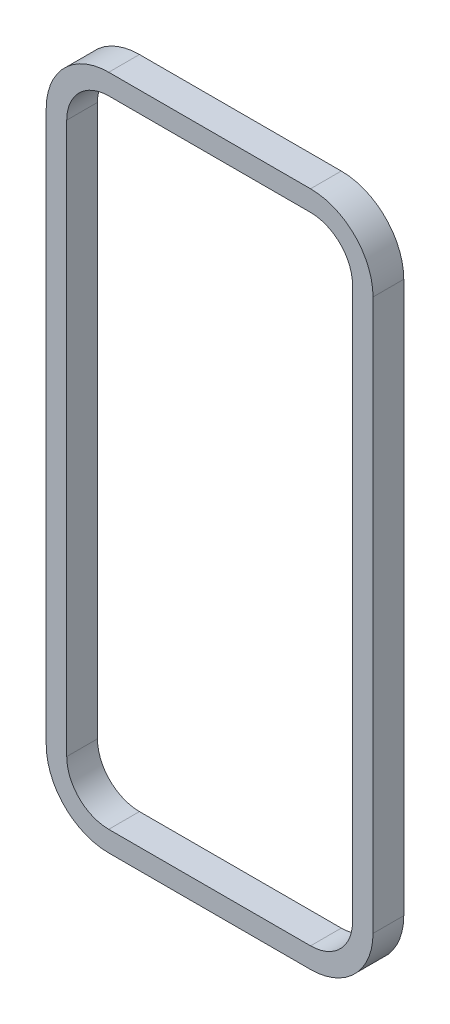
ISO-10303-21;
HEADER;
FILE_DESCRIPTION(('STEP AP214'),'2;1');
FILE_NAME('part.step','',(''),(''),'','','');
FILE_SCHEMA(('AUTOMOTIVE_DESIGN { 1 0 10303 214 1 1 1 1 }'));
ENDSEC;
DATA;
#1=APPLICATION_CONTEXT('core data for automotive mechanical design processes');
#2=APPLICATION_PROTOCOL_DEFINITION('international standard','automotive_design',2000,#1);
#3=PRODUCT_CONTEXT('',#1,'mechanical');
#4=PRODUCT('Part','Part','',(#3));
#5=PRODUCT_RELATED_PRODUCT_CATEGORY('part','',(#4));
#6=PRODUCT_DEFINITION_FORMATION('','',#4);
#7=PRODUCT_DEFINITION_CONTEXT('part definition',#1,'design');
#8=PRODUCT_DEFINITION('design','',#6,#7);
#9=PRODUCT_DEFINITION_SHAPE('','',#8);
#10=(LENGTH_UNIT() NAMED_UNIT(*) SI_UNIT(.MILLI.,.METRE.));
#11=(NAMED_UNIT(*) PLANE_ANGLE_UNIT() SI_UNIT($,.RADIAN.));
#12=(NAMED_UNIT(*) SI_UNIT($,.STERADIAN.) SOLID_ANGLE_UNIT());
#13=UNCERTAINTY_MEASURE_WITH_UNIT(LENGTH_MEASURE(1.E-05),#10,'distance_accuracy_value','');
#14=(GEOMETRIC_REPRESENTATION_CONTEXT(3) GLOBAL_UNCERTAINTY_ASSIGNED_CONTEXT((#13)) GLOBAL_UNIT_ASSIGNED_CONTEXT((#10,
#11,#12)) REPRESENTATION_CONTEXT('',''));
#15=CARTESIAN_POINT('',(0.,0.,0.));
#16=DIRECTION('',(0.,0.,1.));
#17=DIRECTION('',(1.,0.,0.));
#18=AXIS2_PLACEMENT_3D('',#15,#16,#17);
#19=CARTESIAN_POINT('',(-9.85,-26.9,3.));
#20=DIRECTION('',(0.,0.,-1.));
#21=DIRECTION('',(-1.,0.,0.));
#22=AXIS2_PLACEMENT_3D('',#19,#20,#21);
#23=PLANE('',#22);
#24=CARTESIAN_POINT('',(-9.85,-26.9,3.));
#25=DIRECTION('',(0.,0.,1.));
#26=DIRECTION('',(-1.,0.,0.));
#27=AXIS2_PLACEMENT_3D('',#24,#25,#26);
#28=CIRCLE('',#27,6.1);
#29=CARTESIAN_POINT('',(-15.95,-26.9,3.));
#30=VERTEX_POINT('',#29);
#31=CARTESIAN_POINT('',(-9.84999999999997,-33.,3.));
#32=VERTEX_POINT('',#31);
#33=EDGE_CURVE('E247',#30,#32,#28,.T.);
#34=ORIENTED_EDGE('',*,*,#33,.T.);
#35=DIRECTION('',(1.,0.,0.));
#36=VECTOR('',#35,1.);
#37=CARTESIAN_POINT('',(9.84999999999996,-33.,3.));
#38=LINE('',#37,#36);
#39=CARTESIAN_POINT('',(9.84999999999996,-33.,3.));
#40=VERTEX_POINT('',#39);
#41=EDGE_CURVE('E251',#32,#40,#38,.T.);
#42=ORIENTED_EDGE('',*,*,#41,.T.);
#43=CARTESIAN_POINT('',(9.85,-26.9,3.));
#44=DIRECTION('',(0.,0.,1.));
#45=DIRECTION('',(-1.,0.,0.));
#46=AXIS2_PLACEMENT_3D('',#43,#44,#45);
#47=CIRCLE('',#46,6.1);
#48=CARTESIAN_POINT('',(15.95,-26.9,3.));
#49=VERTEX_POINT('',#48);
#50=EDGE_CURVE('E255',#40,#49,#47,.T.);
#51=ORIENTED_EDGE('',*,*,#50,.T.);
#52=DIRECTION('',(0.,1.,0.));
#53=VECTOR('',#52,1.);
#54=CARTESIAN_POINT('',(15.95,-26.9,3.));
#55=LINE('',#54,#53);
#56=CARTESIAN_POINT('',(15.95,26.8999999999999,3.));
#57=VERTEX_POINT('',#56);
#58=EDGE_CURVE('E258',#49,#57,#55,.T.);
#59=ORIENTED_EDGE('',*,*,#58,.T.);
#60=CARTESIAN_POINT('',(9.85,26.9,3.));
#61=DIRECTION('',(0.,0.,1.));
#62=DIRECTION('',(1.,0.,0.));
#63=AXIS2_PLACEMENT_3D('',#60,#61,#62);
#64=CIRCLE('',#63,6.1);
#65=CARTESIAN_POINT('',(9.84999999999997,33.,3.));
#66=VERTEX_POINT('',#65);
#67=EDGE_CURVE('E261',#57,#66,#64,.T.);
#68=ORIENTED_EDGE('',*,*,#67,.T.);
#69=DIRECTION('',(-1.,0.,0.));
#70=VECTOR('',#69,1.);
#71=CARTESIAN_POINT('',(9.84999999999997,33.,3.));
#72=LINE('',#71,#70);
#73=CARTESIAN_POINT('',(-9.84999999999995,33.,3.));
#74=VERTEX_POINT('',#73);
#75=EDGE_CURVE('E264',#66,#74,#72,.T.);
#76=ORIENTED_EDGE('',*,*,#75,.T.);
#77=CARTESIAN_POINT('',(-9.85,26.9,3.));
#78=DIRECTION('',(0.,0.,1.));
#79=DIRECTION('',(-1.,0.,0.));
#80=AXIS2_PLACEMENT_3D('',#77,#78,#79);
#81=CIRCLE('',#80,6.1);
#82=CARTESIAN_POINT('',(-15.95,26.9,3.));
#83=VERTEX_POINT('',#82);
#84=EDGE_CURVE('E267',#74,#83,#81,.T.);
#85=ORIENTED_EDGE('',*,*,#84,.T.);
#86=DIRECTION('',(0.,-1.,0.));
#87=VECTOR('',#86,1.);
#88=CARTESIAN_POINT('',(-15.95,-26.9,3.));
#89=LINE('',#88,#87);
#90=EDGE_CURVE('E270',#83,#30,#89,.T.);
#91=ORIENTED_EDGE('',*,*,#90,.T.);
#92=EDGE_LOOP('',(#34,#42,#51,#59,#68,#76,#85,#91));
#93=FACE_BOUND('',#92,.T.);
#94=CARTESIAN_POINT('',(-9.85,-26.9,3.));
#95=DIRECTION('',(0.,0.,1.));
#96=DIRECTION('',(-1.,0.,0.));
#97=AXIS2_PLACEMENT_3D('',#94,#95,#96);
#98=CIRCLE('',#97,4.1);
#99=CARTESIAN_POINT('',(-13.95,-26.9,3.));
#100=VERTEX_POINT('',#99);
#101=CARTESIAN_POINT('',(-9.84999999999997,-31.,3.));
#102=VERTEX_POINT('',#101);
#103=EDGE_CURVE('E157',#100,#102,#98,.T.);
#104=ORIENTED_EDGE('',*,*,#103,.F.);
#105=DIRECTION('',(0.,-1.,0.));
#106=VECTOR('',#105,1.);
#107=CARTESIAN_POINT('',(-13.95,-26.9,3.));
#108=LINE('',#107,#106);
#109=CARTESIAN_POINT('',(-13.95,26.9,3.));
#110=VERTEX_POINT('',#109);
#111=EDGE_CURVE('E200',#110,#100,#108,.T.);
#112=ORIENTED_EDGE('',*,*,#111,.F.);
#113=CARTESIAN_POINT('',(-9.85,26.9,3.));
#114=DIRECTION('',(0.,0.,1.));
#115=DIRECTION('',(-1.,0.,0.));
#116=AXIS2_PLACEMENT_3D('',#113,#114,#115);
#117=CIRCLE('',#116,4.09999999999999);
#118=CARTESIAN_POINT('',(-9.84999999999997,31.,3.));
#119=VERTEX_POINT('',#118);
#120=EDGE_CURVE('E197',#119,#110,#117,.T.);
#121=ORIENTED_EDGE('',*,*,#120,.F.);
#122=DIRECTION('',(-1.,0.,0.));
#123=VECTOR('',#122,1.);
#124=CARTESIAN_POINT('',(9.84999999999997,31.,3.));
#125=LINE('',#124,#123);
#126=CARTESIAN_POINT('',(9.84999999999997,31.,3.));
#127=VERTEX_POINT('',#126);
#128=EDGE_CURVE('E194',#127,#119,#125,.T.);
#129=ORIENTED_EDGE('',*,*,#128,.F.);
#130=CARTESIAN_POINT('',(9.85,26.9,3.));
#131=DIRECTION('',(0.,0.,1.));
#132=DIRECTION('',(1.,0.,0.));
#133=AXIS2_PLACEMENT_3D('',#130,#131,#132);
#134=CIRCLE('',#133,4.1);
#135=CARTESIAN_POINT('',(13.95,26.9,3.));
#136=VERTEX_POINT('',#135);
#137=EDGE_CURVE('E191',#136,#127,#134,.T.);
#138=ORIENTED_EDGE('',*,*,#137,.F.);
#139=DIRECTION('',(0.,1.,0.));
#140=VECTOR('',#139,1.);
#141=CARTESIAN_POINT('',(13.95,-26.9,3.));
#142=LINE('',#141,#140);
#143=CARTESIAN_POINT('',(13.95,-26.9,3.));
#144=VERTEX_POINT('',#143);
#145=EDGE_CURVE('E186',#144,#136,#142,.T.);
#146=ORIENTED_EDGE('',*,*,#145,.F.);
#147=CARTESIAN_POINT('',(9.85,-26.9,3.));
#148=DIRECTION('',(0.,0.,1.));
#149=DIRECTION('',(-1.,0.,0.));
#150=AXIS2_PLACEMENT_3D('',#147,#148,#149);
#151=CIRCLE('',#150,4.1);
#152=CARTESIAN_POINT('',(9.84999999999998,-31.,3.));
#153=VERTEX_POINT('',#152);
#154=EDGE_CURVE('E180',#153,#144,#151,.T.);
#155=ORIENTED_EDGE('',*,*,#154,.F.);
#156=DIRECTION('',(1.,0.,0.));
#157=VECTOR('',#156,1.);
#158=CARTESIAN_POINT('',(9.84999999999997,-31.,3.));
#159=LINE('',#158,#157);
#160=EDGE_CURVE('E166',#102,#153,#159,.T.);
#161=ORIENTED_EDGE('',*,*,#160,.F.);
#162=EDGE_LOOP('',(#104,#112,#121,#129,#138,#146,#155,#161));
#163=FACE_BOUND('',#162,.T.);
#164=ADVANCED_FACE('F43',(#93,#163),#23,.F.);
#165=CARTESIAN_POINT('',(-9.85,-26.9,0.));
#166=DIRECTION('',(0.,0.,-1.));
#167=DIRECTION('',(-1.,0.,0.));
#168=AXIS2_PLACEMENT_3D('',#165,#166,#167);
#169=PLANE('',#168);
#170=CARTESIAN_POINT('',(-9.85,-26.9,0.));
#171=DIRECTION('',(0.,0.,1.));
#172=DIRECTION('',(-1.,0.,0.));
#173=AXIS2_PLACEMENT_3D('',#170,#171,#172);
#174=CIRCLE('',#173,6.1);
#175=CARTESIAN_POINT('',(-15.95,-26.9,0.));
#176=VERTEX_POINT('',#175);
#177=CARTESIAN_POINT('',(-9.84999999999997,-33.,0.));
#178=VERTEX_POINT('',#177);
#179=EDGE_CURVE('E175',#176,#178,#174,.T.);
#180=ORIENTED_EDGE('',*,*,#179,.F.);
#181=DIRECTION('',(0.,-1.,0.));
#182=VECTOR('',#181,1.);
#183=CARTESIAN_POINT('',(-15.95,-26.9,0.));
#184=LINE('',#183,#182);
#185=CARTESIAN_POINT('',(-15.95,26.9,0.));
#186=VERTEX_POINT('',#185);
#187=EDGE_CURVE('E252',#186,#176,#184,.T.);
#188=ORIENTED_EDGE('',*,*,#187,.F.);
#189=CARTESIAN_POINT('',(-9.85,26.9,0.));
#190=DIRECTION('',(0.,0.,1.));
#191=DIRECTION('',(-1.,0.,0.));
#192=AXIS2_PLACEMENT_3D('',#189,#190,#191);
#193=CIRCLE('',#192,6.1);
#194=CARTESIAN_POINT('',(-9.84999999999995,33.,0.));
#195=VERTEX_POINT('',#194);
#196=EDGE_CURVE('E292',#195,#186,#193,.T.);
#197=ORIENTED_EDGE('',*,*,#196,.F.);
#198=DIRECTION('',(-1.,0.,0.));
#199=VECTOR('',#198,1.);
#200=CARTESIAN_POINT('',(9.84999999999997,33.,0.));
#201=LINE('',#200,#199);
#202=CARTESIAN_POINT('',(9.84999999999997,33.,0.));
#203=VERTEX_POINT('',#202);
#204=EDGE_CURVE('E289',#203,#195,#201,.T.);
#205=ORIENTED_EDGE('',*,*,#204,.F.);
#206=CARTESIAN_POINT('',(9.85,26.9,0.));
#207=DIRECTION('',(0.,0.,1.));
#208=DIRECTION('',(1.,0.,0.));
#209=AXIS2_PLACEMENT_3D('',#206,#207,#208);
#210=CIRCLE('',#209,6.1);
#211=CARTESIAN_POINT('',(15.95,26.8999999999999,0.));
#212=VERTEX_POINT('',#211);
#213=EDGE_CURVE('E286',#212,#203,#210,.T.);
#214=ORIENTED_EDGE('',*,*,#213,.F.);
#215=DIRECTION('',(0.,1.,0.));
#216=VECTOR('',#215,1.);
#217=CARTESIAN_POINT('',(15.95,-26.9,0.));
#218=LINE('',#217,#216);
#219=CARTESIAN_POINT('',(15.95,-26.9,0.));
#220=VERTEX_POINT('',#219);
#221=EDGE_CURVE('E283',#220,#212,#218,.T.);
#222=ORIENTED_EDGE('',*,*,#221,.F.);
#223=CARTESIAN_POINT('',(9.85,-26.9,0.));
#224=DIRECTION('',(0.,0.,1.));
#225=DIRECTION('',(-1.,0.,0.));
#226=AXIS2_PLACEMENT_3D('',#223,#224,#225);
#227=CIRCLE('',#226,6.1);
#228=CARTESIAN_POINT('',(9.84999999999996,-33.,0.));
#229=VERTEX_POINT('',#228);
#230=EDGE_CURVE('E280',#229,#220,#227,.T.);
#231=ORIENTED_EDGE('',*,*,#230,.F.);
#232=DIRECTION('',(1.,0.,0.));
#233=VECTOR('',#232,1.);
#234=CARTESIAN_POINT('',(9.84999999999996,-33.,0.));
#235=LINE('',#234,#233);
#236=EDGE_CURVE('E277',#178,#229,#235,.T.);
#237=ORIENTED_EDGE('',*,*,#236,.F.);
#238=EDGE_LOOP('',(#180,#188,#197,#205,#214,#222,#231,#237));
#239=FACE_BOUND('',#238,.T.);
#240=DIRECTION('',(0.,-1.,0.));
#241=VECTOR('',#240,1.);
#242=CARTESIAN_POINT('',(-13.95,-26.9,0.));
#243=LINE('',#242,#241);
#244=CARTESIAN_POINT('',(-13.95,26.9,0.));
#245=VERTEX_POINT('',#244);
#246=CARTESIAN_POINT('',(-13.95,-26.9,0.));
#247=VERTEX_POINT('',#246);
#248=EDGE_CURVE('E167',#245,#247,#243,.T.);
#249=ORIENTED_EDGE('',*,*,#248,.T.);
#250=CARTESIAN_POINT('',(-9.85,-26.9,0.));
#251=DIRECTION('',(0.,0.,1.));
#252=DIRECTION('',(-1.,0.,0.));
#253=AXIS2_PLACEMENT_3D('',#250,#251,#252);
#254=CIRCLE('',#253,4.1);
#255=CARTESIAN_POINT('',(-9.84999999999997,-31.,0.));
#256=VERTEX_POINT('',#255);
#257=EDGE_CURVE('E67',#247,#256,#254,.T.);
#258=ORIENTED_EDGE('',*,*,#257,.T.);
#259=DIRECTION('',(1.,0.,0.));
#260=VECTOR('',#259,1.);
#261=CARTESIAN_POINT('',(9.84999999999997,-31.,0.));
#262=LINE('',#261,#260);
#263=CARTESIAN_POINT('',(9.84999999999998,-31.,0.));
#264=VERTEX_POINT('',#263);
#265=EDGE_CURVE('E173',#256,#264,#262,.T.);
#266=ORIENTED_EDGE('',*,*,#265,.T.);
#267=CARTESIAN_POINT('',(9.85,-26.9,0.));
#268=DIRECTION('',(0.,0.,1.));
#269=DIRECTION('',(-1.,0.,0.));
#270=AXIS2_PLACEMENT_3D('',#267,#268,#269);
#271=CIRCLE('',#270,4.1);
#272=CARTESIAN_POINT('',(13.95,-26.9,0.));
#273=VERTEX_POINT('',#272);
#274=EDGE_CURVE('E207',#264,#273,#271,.T.);
#275=ORIENTED_EDGE('',*,*,#274,.T.);
#276=DIRECTION('',(0.,1.,0.));
#277=VECTOR('',#276,1.);
#278=CARTESIAN_POINT('',(13.95,-26.9,0.));
#279=LINE('',#278,#277);
#280=CARTESIAN_POINT('',(13.95,26.9,0.));
#281=VERTEX_POINT('',#280);
#282=EDGE_CURVE('E211',#273,#281,#279,.T.);
#283=ORIENTED_EDGE('',*,*,#282,.T.);
#284=CARTESIAN_POINT('',(9.85,26.9,0.));
#285=DIRECTION('',(0.,0.,1.));
#286=DIRECTION('',(1.,0.,0.));
#287=AXIS2_PLACEMENT_3D('',#284,#285,#286);
#288=CIRCLE('',#287,4.1);
#289=CARTESIAN_POINT('',(9.84999999999997,31.,0.));
#290=VERTEX_POINT('',#289);
#291=EDGE_CURVE('E215',#281,#290,#288,.T.);
#292=ORIENTED_EDGE('',*,*,#291,.T.);
#293=DIRECTION('',(-1.,0.,0.));
#294=VECTOR('',#293,1.);
#295=CARTESIAN_POINT('',(9.84999999999997,31.,0.));
#296=LINE('',#295,#294);
#297=CARTESIAN_POINT('',(-9.84999999999997,31.,0.));
#298=VERTEX_POINT('',#297);
#299=EDGE_CURVE('E219',#290,#298,#296,.T.);
#300=ORIENTED_EDGE('',*,*,#299,.T.);
#301=CARTESIAN_POINT('',(-9.85,26.9,0.));
#302=DIRECTION('',(0.,0.,1.));
#303=DIRECTION('',(-1.,0.,0.));
#304=AXIS2_PLACEMENT_3D('',#301,#302,#303);
#305=CIRCLE('',#304,4.09999999999999);
#306=EDGE_CURVE('E223',#298,#245,#305,.T.);
#307=ORIENTED_EDGE('',*,*,#306,.T.);
#308=EDGE_LOOP('',(#249,#258,#266,#275,#283,#292,#300,#307));
#309=FACE_BOUND('',#308,.T.);
#310=ADVANCED_FACE('F330',(#239,#309),#169,.T.);
#311=CARTESIAN_POINT('',(-9.85,-26.9,3.));
#312=DIRECTION('',(0.,0.,-1.));
#313=DIRECTION('',(-1.,0.,0.));
#314=AXIS2_PLACEMENT_3D('',#311,#312,#313);
#315=CYLINDRICAL_SURFACE('',#314,6.1);
#316=ORIENTED_EDGE('',*,*,#179,.T.);
#317=DIRECTION('',(0.,0.,-1.));
#318=VECTOR('',#317,1.);
#319=CARTESIAN_POINT('',(-9.84999999999997,-33.,3.));
#320=LINE('',#319,#318);
#321=EDGE_CURVE('E11',#32,#178,#320,.T.);
#322=ORIENTED_EDGE('',*,*,#321,.F.);
#323=ORIENTED_EDGE('',*,*,#33,.F.);
#324=DIRECTION('',(0.,0.,-1.));
#325=VECTOR('',#324,1.);
#326=CARTESIAN_POINT('',(-15.95,-26.9,3.));
#327=LINE('',#326,#325);
#328=EDGE_CURVE('E273',#30,#176,#327,.T.);
#329=ORIENTED_EDGE('',*,*,#328,.T.);
#330=EDGE_LOOP('',(#316,#322,#323,#329));
#331=FACE_BOUND('',#330,.T.);
#332=ADVANCED_FACE('F45',(#331),#315,.T.);
#333=CARTESIAN_POINT('',(9.84999999999996,-33.,3.));
#334=DIRECTION('',(0.,1.,0.));
#335=DIRECTION('',(0.,0.,1.));
#336=AXIS2_PLACEMENT_3D('',#333,#334,#335);
#337=PLANE('',#336);
#338=ORIENTED_EDGE('',*,*,#236,.T.);
#339=DIRECTION('',(0.,0.,-1.));
#340=VECTOR('',#339,1.);
#341=CARTESIAN_POINT('',(9.84999999999996,-33.,3.));
#342=LINE('',#341,#340);
#343=EDGE_CURVE('E52',#40,#229,#342,.T.);
#344=ORIENTED_EDGE('',*,*,#343,.F.);
#345=ORIENTED_EDGE('',*,*,#41,.F.);
#346=ORIENTED_EDGE('',*,*,#321,.T.);
#347=EDGE_LOOP('',(#338,#344,#345,#346));
#348=FACE_BOUND('',#347,.T.);
#349=ADVANCED_FACE('F347',(#348),#337,.F.);
#350=CARTESIAN_POINT('',(9.85,-26.9,3.));
#351=DIRECTION('',(0.,0.,-1.));
#352=DIRECTION('',(-1.,0.,0.));
#353=AXIS2_PLACEMENT_3D('',#350,#351,#352);
#354=CYLINDRICAL_SURFACE('',#353,6.1);
#355=ORIENTED_EDGE('',*,*,#230,.T.);
#356=DIRECTION('',(0.,0.,-1.));
#357=VECTOR('',#356,1.);
#358=CARTESIAN_POINT('',(15.95,-26.9,3.));
#359=LINE('',#358,#357);
#360=EDGE_CURVE('E315',#49,#220,#359,.T.);
#361=ORIENTED_EDGE('',*,*,#360,.F.);
#362=ORIENTED_EDGE('',*,*,#50,.F.);
#363=ORIENTED_EDGE('',*,*,#343,.T.);
#364=EDGE_LOOP('',(#355,#361,#362,#363));
#365=FACE_BOUND('',#364,.T.);
#366=ADVANCED_FACE('F324',(#365),#354,.T.);
#367=CARTESIAN_POINT('',(15.95,-26.9,3.));
#368=DIRECTION('',(-1.,0.,0.));
#369=DIRECTION('',(0.,-1.,0.));
#370=AXIS2_PLACEMENT_3D('',#367,#368,#369);
#371=PLANE('',#370);
#372=ORIENTED_EDGE('',*,*,#221,.T.);
#373=DIRECTION('',(0.,0.,-1.));
#374=VECTOR('',#373,1.);
#375=CARTESIAN_POINT('',(15.95,26.8999999999999,3.));
#376=LINE('',#375,#374);
#377=EDGE_CURVE('E311',#57,#212,#376,.T.);
#378=ORIENTED_EDGE('',*,*,#377,.F.);
#379=ORIENTED_EDGE('',*,*,#58,.F.);
#380=ORIENTED_EDGE('',*,*,#360,.T.);
#381=EDGE_LOOP('',(#372,#378,#379,#380));
#382=FACE_BOUND('',#381,.T.);
#383=ADVANCED_FACE('F336',(#382),#371,.F.);
#384=CARTESIAN_POINT('',(9.85,26.9,3.));
#385=DIRECTION('',(0.,0.,-1.));
#386=DIRECTION('',(-1.,0.,0.));
#387=AXIS2_PLACEMENT_3D('',#384,#385,#386);
#388=CYLINDRICAL_SURFACE('',#387,6.1);
#389=ORIENTED_EDGE('',*,*,#213,.T.);
#390=DIRECTION('',(0.,0.,-1.));
#391=VECTOR('',#390,1.);
#392=CARTESIAN_POINT('',(9.84999999999997,33.,3.));
#393=LINE('',#392,#391);
#394=EDGE_CURVE('E307',#66,#203,#393,.T.);
#395=ORIENTED_EDGE('',*,*,#394,.F.);
#396=ORIENTED_EDGE('',*,*,#67,.F.);
#397=ORIENTED_EDGE('',*,*,#377,.T.);
#398=EDGE_LOOP('',(#389,#395,#396,#397));
#399=FACE_BOUND('',#398,.T.);
#400=ADVANCED_FACE('F340',(#399),#388,.T.);
#401=CARTESIAN_POINT('',(9.84999999999997,33.,3.));
#402=DIRECTION('',(0.,-1.,0.));
#403=DIRECTION('',(0.,0.,-1.));
#404=AXIS2_PLACEMENT_3D('',#401,#402,#403);
#405=PLANE('',#404);
#406=ORIENTED_EDGE('',*,*,#204,.T.);
#407=DIRECTION('',(0.,0.,-1.));
#408=VECTOR('',#407,1.);
#409=CARTESIAN_POINT('',(-9.84999999999995,33.,3.));
#410=LINE('',#409,#408);
#411=EDGE_CURVE('E303',#74,#195,#410,.T.);
#412=ORIENTED_EDGE('',*,*,#411,.F.);
#413=ORIENTED_EDGE('',*,*,#75,.F.);
#414=ORIENTED_EDGE('',*,*,#394,.T.);
#415=EDGE_LOOP('',(#406,#412,#413,#414));
#416=FACE_BOUND('',#415,.T.);
#417=ADVANCED_FACE('F360',(#416),#405,.F.);
#418=CARTESIAN_POINT('',(-9.85,26.9,3.));
#419=DIRECTION('',(0.,0.,-1.));
#420=DIRECTION('',(-1.,0.,0.));
#421=AXIS2_PLACEMENT_3D('',#418,#419,#420);
#422=CYLINDRICAL_SURFACE('',#421,6.1);
#423=ORIENTED_EDGE('',*,*,#196,.T.);
#424=DIRECTION('',(0.,0.,-1.));
#425=VECTOR('',#424,1.);
#426=CARTESIAN_POINT('',(-15.95,26.9,3.));
#427=LINE('',#426,#425);
#428=EDGE_CURVE('E300',#83,#186,#427,.T.);
#429=ORIENTED_EDGE('',*,*,#428,.F.);
#430=ORIENTED_EDGE('',*,*,#84,.F.);
#431=ORIENTED_EDGE('',*,*,#411,.T.);
#432=EDGE_LOOP('',(#423,#429,#430,#431));
#433=FACE_BOUND('',#432,.T.);
#434=ADVANCED_FACE('F358',(#433),#422,.T.);
#435=CARTESIAN_POINT('',(-15.95,-26.9,3.));
#436=DIRECTION('',(1.,0.,0.));
#437=DIRECTION('',(0.,0.,-1.));
#438=AXIS2_PLACEMENT_3D('',#435,#436,#437);
#439=PLANE('',#438);
#440=ORIENTED_EDGE('',*,*,#187,.T.);
#441=ORIENTED_EDGE('',*,*,#328,.F.);
#442=ORIENTED_EDGE('',*,*,#90,.F.);
#443=ORIENTED_EDGE('',*,*,#428,.T.);
#444=EDGE_LOOP('',(#440,#441,#442,#443));
#445=FACE_BOUND('',#444,.T.);
#446=ADVANCED_FACE('F353',(#445),#439,.F.);
#447=CARTESIAN_POINT('',(-9.85,-26.9,3.));
#448=DIRECTION('',(0.,0.,-1.));
#449=DIRECTION('',(-1.,0.,0.));
#450=AXIS2_PLACEMENT_3D('',#447,#448,#449);
#451=CYLINDRICAL_SURFACE('',#450,4.1);
#452=ORIENTED_EDGE('',*,*,#257,.F.);
#453=DIRECTION('',(0.,0.,-1.));
#454=VECTOR('',#453,1.);
#455=CARTESIAN_POINT('',(-13.95,-26.9,3.));
#456=LINE('',#455,#454);
#457=EDGE_CURVE('E161',#100,#247,#456,.T.);
#458=ORIENTED_EDGE('',*,*,#457,.F.);
#459=ORIENTED_EDGE('',*,*,#103,.T.);
#460=DIRECTION('',(0.,0.,-1.));
#461=VECTOR('',#460,1.);
#462=CARTESIAN_POINT('',(-9.84999999999997,-31.,3.));
#463=LINE('',#462,#461);
#464=EDGE_CURVE('E160',#102,#256,#463,.T.);
#465=ORIENTED_EDGE('',*,*,#464,.T.);
#466=EDGE_LOOP('',(#452,#458,#459,#465));
#467=FACE_BOUND('',#466,.T.);
#468=ADVANCED_FACE('F159',(#467),#451,.F.);
#469=CARTESIAN_POINT('',(9.84999999999997,-31.,3.));
#470=DIRECTION('',(0.,1.,0.));
#471=DIRECTION('',(-1.,0.,0.));
#472=AXIS2_PLACEMENT_3D('',#469,#470,#471);
#473=PLANE('',#472);
#474=ORIENTED_EDGE('',*,*,#265,.F.);
#475=ORIENTED_EDGE('',*,*,#464,.F.);
#476=ORIENTED_EDGE('',*,*,#160,.T.);
#477=DIRECTION('',(0.,0.,-1.));
#478=VECTOR('',#477,1.);
#479=CARTESIAN_POINT('',(9.84999999999998,-31.,3.));
#480=LINE('',#479,#478);
#481=EDGE_CURVE('E176',#153,#264,#480,.T.);
#482=ORIENTED_EDGE('',*,*,#481,.T.);
#483=EDGE_LOOP('',(#474,#475,#476,#482));
#484=FACE_BOUND('',#483,.T.);
#485=ADVANCED_FACE('F170',(#484),#473,.T.);
#486=CARTESIAN_POINT('',(9.85,-26.9,3.));
#487=DIRECTION('',(0.,0.,-1.));
#488=DIRECTION('',(-1.,0.,0.));
#489=AXIS2_PLACEMENT_3D('',#486,#487,#488);
#490=CYLINDRICAL_SURFACE('',#489,4.1);
#491=ORIENTED_EDGE('',*,*,#274,.F.);
#492=ORIENTED_EDGE('',*,*,#481,.F.);
#493=ORIENTED_EDGE('',*,*,#154,.T.);
#494=DIRECTION('',(0.,0.,-1.));
#495=VECTOR('',#494,1.);
#496=CARTESIAN_POINT('',(13.95,-26.9,3.));
#497=LINE('',#496,#495);
#498=EDGE_CURVE('E242',#144,#273,#497,.T.);
#499=ORIENTED_EDGE('',*,*,#498,.T.);
#500=EDGE_LOOP('',(#491,#492,#493,#499));
#501=FACE_BOUND('',#500,.T.);
#502=ADVANCED_FACE('F381',(#501),#490,.F.);
#503=CARTESIAN_POINT('',(13.95,-26.9,3.));
#504=DIRECTION('',(-1.,0.,0.));
#505=DIRECTION('',(0.,-1.,0.));
#506=AXIS2_PLACEMENT_3D('',#503,#504,#505);
#507=PLANE('',#506);
#508=ORIENTED_EDGE('',*,*,#282,.F.);
#509=ORIENTED_EDGE('',*,*,#498,.F.);
#510=ORIENTED_EDGE('',*,*,#145,.T.);
#511=DIRECTION('',(0.,0.,-1.));
#512=VECTOR('',#511,1.);
#513=CARTESIAN_POINT('',(13.95,26.9,3.));
#514=LINE('',#513,#512);
#515=EDGE_CURVE('E239',#136,#281,#514,.T.);
#516=ORIENTED_EDGE('',*,*,#515,.T.);
#517=EDGE_LOOP('',(#508,#509,#510,#516));
#518=FACE_BOUND('',#517,.T.);
#519=ADVANCED_FACE('F384',(#518),#507,.T.);
#520=CARTESIAN_POINT('',(9.85,26.9,3.));
#521=DIRECTION('',(0.,0.,-1.));
#522=DIRECTION('',(-1.,0.,0.));
#523=AXIS2_PLACEMENT_3D('',#520,#521,#522);
#524=CYLINDRICAL_SURFACE('',#523,4.1);
#525=ORIENTED_EDGE('',*,*,#291,.F.);
#526=ORIENTED_EDGE('',*,*,#515,.F.);
#527=ORIENTED_EDGE('',*,*,#137,.T.);
#528=DIRECTION('',(0.,0.,-1.));
#529=VECTOR('',#528,1.);
#530=CARTESIAN_POINT('',(9.84999999999997,31.,3.));
#531=LINE('',#530,#529);
#532=EDGE_CURVE('E236',#127,#290,#531,.T.);
#533=ORIENTED_EDGE('',*,*,#532,.T.);
#534=EDGE_LOOP('',(#525,#526,#527,#533));
#535=FACE_BOUND('',#534,.T.);
#536=ADVANCED_FACE('F390',(#535),#524,.F.);
#537=CARTESIAN_POINT('',(9.84999999999997,31.,3.));
#538=DIRECTION('',(0.,-1.,0.));
#539=DIRECTION('',(1.,0.,0.));
#540=AXIS2_PLACEMENT_3D('',#537,#538,#539);
#541=PLANE('',#540);
#542=ORIENTED_EDGE('',*,*,#299,.F.);
#543=ORIENTED_EDGE('',*,*,#532,.F.);
#544=ORIENTED_EDGE('',*,*,#128,.T.);
#545=DIRECTION('',(0.,0.,-1.));
#546=VECTOR('',#545,1.);
#547=CARTESIAN_POINT('',(-9.84999999999997,31.,3.));
#548=LINE('',#547,#546);
#549=EDGE_CURVE('E233',#119,#298,#548,.T.);
#550=ORIENTED_EDGE('',*,*,#549,.T.);
#551=EDGE_LOOP('',(#542,#543,#544,#550));
#552=FACE_BOUND('',#551,.T.);
#553=ADVANCED_FACE('F394',(#552),#541,.T.);
#554=CARTESIAN_POINT('',(-9.85,26.9,3.));
#555=DIRECTION('',(0.,0.,-1.));
#556=DIRECTION('',(-1.,0.,0.));
#557=AXIS2_PLACEMENT_3D('',#554,#555,#556);
#558=CYLINDRICAL_SURFACE('',#557,4.09999999999999);
#559=ORIENTED_EDGE('',*,*,#306,.F.);
#560=ORIENTED_EDGE('',*,*,#549,.F.);
#561=ORIENTED_EDGE('',*,*,#120,.T.);
#562=DIRECTION('',(0.,0.,-1.));
#563=VECTOR('',#562,1.);
#564=CARTESIAN_POINT('',(-13.95,26.9,3.));
#565=LINE('',#564,#563);
#566=EDGE_CURVE('E59',#110,#245,#565,.T.);
#567=ORIENTED_EDGE('',*,*,#566,.T.);
#568=EDGE_LOOP('',(#559,#560,#561,#567));
#569=FACE_BOUND('',#568,.T.);
#570=ADVANCED_FACE('F398',(#569),#558,.F.);
#571=CARTESIAN_POINT('',(-13.95,-26.9,3.));
#572=DIRECTION('',(1.,0.,0.));
#573=DIRECTION('',(0.,0.,-1.));
#574=AXIS2_PLACEMENT_3D('',#571,#572,#573);
#575=PLANE('',#574);
#576=ORIENTED_EDGE('',*,*,#248,.F.);
#577=ORIENTED_EDGE('',*,*,#566,.F.);
#578=ORIENTED_EDGE('',*,*,#111,.T.);
#579=ORIENTED_EDGE('',*,*,#457,.T.);
#580=EDGE_LOOP('',(#576,#577,#578,#579));
#581=FACE_BOUND('',#580,.T.);
#582=ADVANCED_FACE('F402',(#581),#575,.T.);
#583=CLOSED_SHELL('',(#164,#310,#332,#349,#366,#383,#400,#417,#434,#446,#468,#485,#502,#519,
#536,#553,#570,#582));
#584=MANIFOLD_SOLID_BREP('B2',#583);
#585=ADVANCED_BREP_SHAPE_REPRESENTATION('',(#18,#584),#14);
#586=SHAPE_DEFINITION_REPRESENTATION(#9,#585);
ENDSEC;
END-ISO-10303-21;
